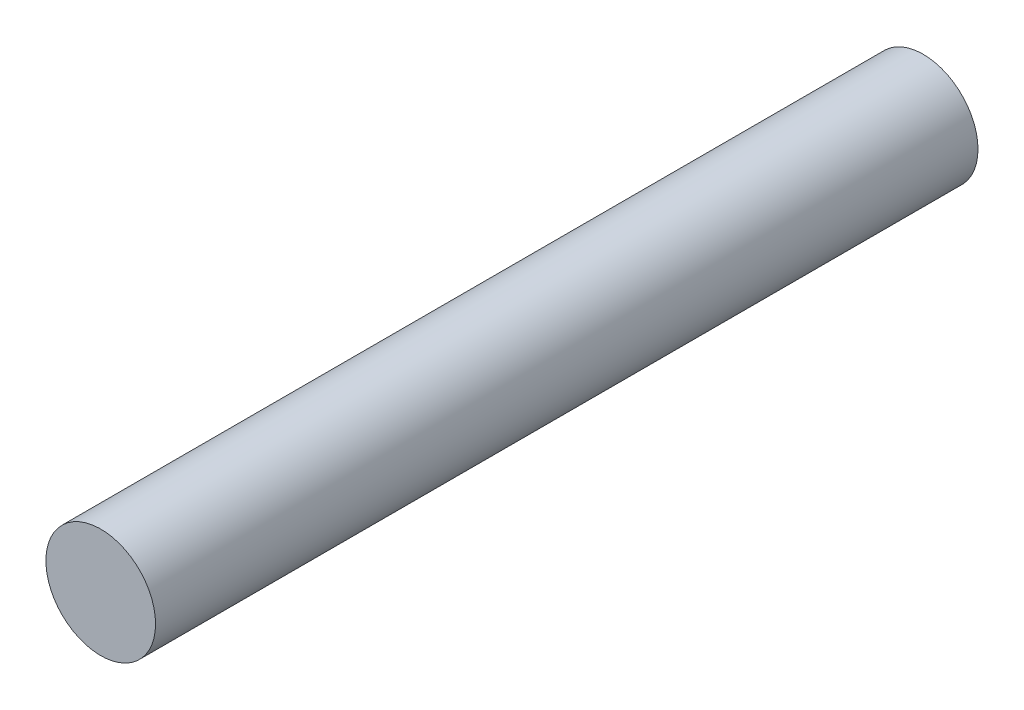
ISO-10303-21;
HEADER;
FILE_DESCRIPTION(('STEP AP214'),'2;1');
FILE_NAME('part.step','',(''),(''),'','','');
FILE_SCHEMA(('AUTOMOTIVE_DESIGN { 1 0 10303 214 1 1 1 1 }'));
ENDSEC;
DATA;
#1=APPLICATION_CONTEXT('core data for automotive mechanical design processes');
#2=APPLICATION_PROTOCOL_DEFINITION('international standard','automotive_design',2000,#1);
#3=PRODUCT_CONTEXT('',#1,'mechanical');
#4=PRODUCT('Part','Part','',(#3));
#5=PRODUCT_RELATED_PRODUCT_CATEGORY('part','',(#4));
#6=PRODUCT_DEFINITION_FORMATION('','',#4);
#7=PRODUCT_DEFINITION_CONTEXT('part definition',#1,'design');
#8=PRODUCT_DEFINITION('design','',#6,#7);
#9=PRODUCT_DEFINITION_SHAPE('','',#8);
#10=(LENGTH_UNIT() NAMED_UNIT(*) SI_UNIT(.MILLI.,.METRE.));
#11=(NAMED_UNIT(*) PLANE_ANGLE_UNIT() SI_UNIT($,.RADIAN.));
#12=(NAMED_UNIT(*) SI_UNIT($,.STERADIAN.) SOLID_ANGLE_UNIT());
#13=UNCERTAINTY_MEASURE_WITH_UNIT(LENGTH_MEASURE(1.E-05),#10,'distance_accuracy_value','');
#14=(GEOMETRIC_REPRESENTATION_CONTEXT(3) GLOBAL_UNCERTAINTY_ASSIGNED_CONTEXT((#13)) GLOBAL_UNIT_ASSIGNED_CONTEXT((#10,
#11,#12)) REPRESENTATION_CONTEXT('',''));
#15=CARTESIAN_POINT('',(0.,0.,0.));
#16=DIRECTION('',(0.,0.,1.));
#17=DIRECTION('',(1.,0.,0.));
#18=AXIS2_PLACEMENT_3D('',#15,#16,#17);
#19=CARTESIAN_POINT('',(0.,0.,75.));
#20=DIRECTION('',(0.,0.,-1.));
#21=DIRECTION('',(-1.,0.,0.));
#22=AXIS2_PLACEMENT_3D('',#19,#20,#21);
#23=CYLINDRICAL_SURFACE('',#22,5.);
#24=CARTESIAN_POINT('',(0.,0.,75.));
#25=DIRECTION('',(0.,0.,1.));
#26=DIRECTION('',(1.,0.,0.));
#27=AXIS2_PLACEMENT_3D('',#24,#25,#26);
#28=CIRCLE('',#27,5.);
#29=CARTESIAN_POINT('',(5.,0.,75.));
#30=VERTEX_POINT('',#29);
#31=EDGE_CURVE('E10',#30,#30,#28,.T.);
#32=ORIENTED_EDGE('',*,*,#31,.F.);
#33=EDGE_LOOP('',(#32));
#34=FACE_BOUND('',#33,.T.);
#35=CARTESIAN_POINT('',(0.,0.,0.));
#36=DIRECTION('',(0.,0.,1.));
#37=DIRECTION('',(1.,0.,0.));
#38=AXIS2_PLACEMENT_3D('',#35,#36,#37);
#39=CIRCLE('',#38,5.);
#40=CARTESIAN_POINT('',(5.,0.,0.));
#41=VERTEX_POINT('',#40);
#42=EDGE_CURVE('E40',#41,#41,#39,.T.);
#43=ORIENTED_EDGE('',*,*,#42,.T.);
#44=EDGE_LOOP('',(#43));
#45=FACE_BOUND('',#44,.T.);
#46=ADVANCED_FACE('F37',(#34,#45),#23,.T.);
#47=CARTESIAN_POINT('',(0.,0.,75.));
#48=DIRECTION('',(0.,0.,1.));
#49=DIRECTION('',(1.,0.,0.));
#50=AXIS2_PLACEMENT_3D('',#47,#48,#49);
#51=PLANE('',#50);
#52=ORIENTED_EDGE('',*,*,#31,.T.);
#53=EDGE_LOOP('',(#52));
#54=FACE_BOUND('',#53,.T.);
#55=ADVANCED_FACE('F54',(#54),#51,.T.);
#56=CARTESIAN_POINT('',(0.,0.,0.));
#57=DIRECTION('',(0.,0.,1.));
#58=DIRECTION('',(1.,0.,0.));
#59=AXIS2_PLACEMENT_3D('',#56,#57,#58);
#60=PLANE('',#59);
#61=ORIENTED_EDGE('',*,*,#42,.F.);
#62=EDGE_LOOP('',(#61));
#63=FACE_BOUND('',#62,.T.);
#64=ADVANCED_FACE('F52',(#63),#60,.F.);
#65=CLOSED_SHELL('',(#46,#55,#64));
#66=MANIFOLD_SOLID_BREP('B2',#65);
#67=ADVANCED_BREP_SHAPE_REPRESENTATION('',(#18,#66),#14);
#68=SHAPE_DEFINITION_REPRESENTATION(#9,#67);
ENDSEC;
END-ISO-10303-21;
